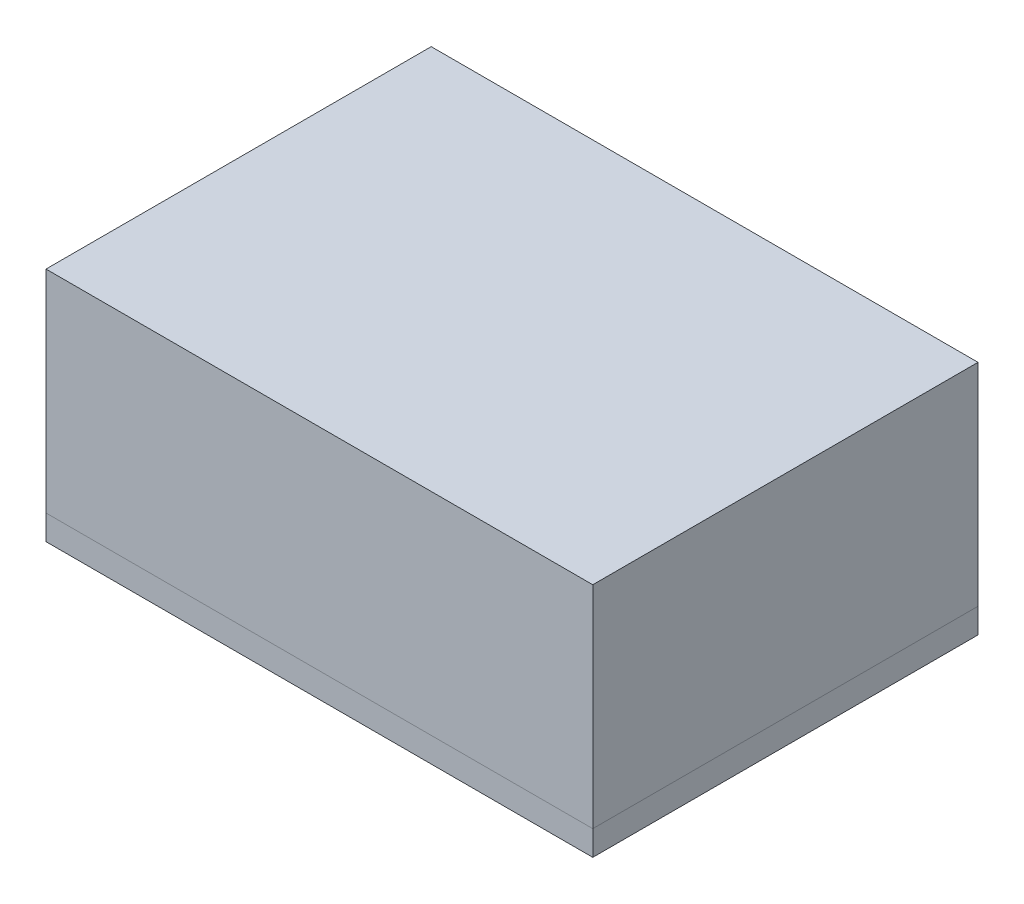
ISO-10303-21;
HEADER;
FILE_DESCRIPTION(('STEP AP214'),'2;1');
FILE_NAME('part.step','',(''),(''),'','','');
FILE_SCHEMA(('AUTOMOTIVE_DESIGN { 1 0 10303 214 1 1 1 1 }'));
ENDSEC;
DATA;
#1=APPLICATION_CONTEXT('core data for automotive mechanical design processes');
#2=APPLICATION_PROTOCOL_DEFINITION('international standard','automotive_design',2000,#1);
#3=PRODUCT_CONTEXT('',#1,'mechanical');
#4=PRODUCT('Part','Part','',(#3));
#5=PRODUCT_RELATED_PRODUCT_CATEGORY('part','',(#4));
#6=PRODUCT_DEFINITION_FORMATION('','',#4);
#7=PRODUCT_DEFINITION_CONTEXT('part definition',#1,'design');
#8=PRODUCT_DEFINITION('design','',#6,#7);
#9=PRODUCT_DEFINITION_SHAPE('','',#8);
#10=(LENGTH_UNIT() NAMED_UNIT(*) SI_UNIT(.MILLI.,.METRE.));
#11=(NAMED_UNIT(*) PLANE_ANGLE_UNIT() SI_UNIT($,.RADIAN.));
#12=(NAMED_UNIT(*) SI_UNIT($,.STERADIAN.) SOLID_ANGLE_UNIT());
#13=UNCERTAINTY_MEASURE_WITH_UNIT(LENGTH_MEASURE(1.E-05),#10,'distance_accuracy_value','');
#14=(GEOMETRIC_REPRESENTATION_CONTEXT(3) GLOBAL_UNCERTAINTY_ASSIGNED_CONTEXT((#13)) GLOBAL_UNIT_ASSIGNED_CONTEXT((#10,
#11,#12)) REPRESENTATION_CONTEXT('',''));
#15=CARTESIAN_POINT('',(0.,0.,0.));
#16=DIRECTION('',(0.,0.,1.));
#17=DIRECTION('',(1.,0.,0.));
#18=AXIS2_PLACEMENT_3D('',#15,#16,#17);
#19=CARTESIAN_POINT('',(0.,1.,0.));
#20=DIRECTION('',(1.,0.,0.));
#21=DIRECTION('',(0.,0.,-1.));
#22=AXIS2_PLACEMENT_3D('',#19,#20,#21);
#23=PLANE('',#22);
#24=DIRECTION('',(0.,-1.,0.));
#25=VECTOR('',#24,1.);
#26=CARTESIAN_POINT('',(0.,1.,15.5));
#27=LINE('',#26,#25);
#28=CARTESIAN_POINT('',(0.,1.,15.5));
#29=VERTEX_POINT('',#28);
#30=CARTESIAN_POINT('',(0.,0.,15.5));
#31=VERTEX_POINT('',#30);
#32=EDGE_CURVE('E90',#29,#31,#27,.T.);
#33=ORIENTED_EDGE('',*,*,#32,.F.);
#34=DIRECTION('',(0.,0.,-1.));
#35=VECTOR('',#34,1.);
#36=CARTESIAN_POINT('',(0.,1.,0.));
#37=LINE('',#36,#35);
#38=CARTESIAN_POINT('',(0.,1.,0.));
#39=VERTEX_POINT('',#38);
#40=EDGE_CURVE('E13',#29,#39,#37,.T.);
#41=ORIENTED_EDGE('',*,*,#40,.T.);
#42=DIRECTION('',(0.,-1.,0.));
#43=VECTOR('',#42,1.);
#44=CARTESIAN_POINT('',(0.,1.,0.));
#45=LINE('',#44,#43);
#46=CARTESIAN_POINT('',(0.,0.,0.));
#47=VERTEX_POINT('',#46);
#48=EDGE_CURVE('E108',#39,#47,#45,.T.);
#49=ORIENTED_EDGE('',*,*,#48,.T.);
#50=DIRECTION('',(0.,0.,1.));
#51=VECTOR('',#50,1.);
#52=CARTESIAN_POINT('',(0.,0.,0.));
#53=LINE('',#52,#51);
#54=EDGE_CURVE('E103',#47,#31,#53,.T.);
#55=ORIENTED_EDGE('',*,*,#54,.T.);
#56=EDGE_LOOP('',(#33,#41,#49,#55));
#57=FACE_BOUND('',#56,.T.);
#58=ADVANCED_FACE('F51',(#57),#23,.F.);
#59=CARTESIAN_POINT('',(0.,1.,15.5));
#60=DIRECTION('',(0.,0.,-1.));
#61=DIRECTION('',(-1.,0.,0.));
#62=AXIS2_PLACEMENT_3D('',#59,#60,#61);
#63=PLANE('',#62);
#64=DIRECTION('',(0.,-1.,0.));
#65=VECTOR('',#64,1.);
#66=CARTESIAN_POINT('',(22.,1.,15.5));
#67=LINE('',#66,#65);
#68=CARTESIAN_POINT('',(22.,1.,15.5));
#69=VERTEX_POINT('',#68);
#70=CARTESIAN_POINT('',(22.,0.,15.5));
#71=VERTEX_POINT('',#70);
#72=EDGE_CURVE('E97',#69,#71,#67,.T.);
#73=ORIENTED_EDGE('',*,*,#72,.F.);
#74=DIRECTION('',(-1.,0.,0.));
#75=VECTOR('',#74,1.);
#76=CARTESIAN_POINT('',(0.,1.,15.5));
#77=LINE('',#76,#75);
#78=EDGE_CURVE('E58',#69,#29,#77,.T.);
#79=ORIENTED_EDGE('',*,*,#78,.T.);
#80=ORIENTED_EDGE('',*,*,#32,.T.);
#81=DIRECTION('',(1.,0.,0.));
#82=VECTOR('',#81,1.);
#83=CARTESIAN_POINT('',(0.,0.,15.5));
#84=LINE('',#83,#82);
#85=EDGE_CURVE('E93',#31,#71,#84,.T.);
#86=ORIENTED_EDGE('',*,*,#85,.T.);
#87=EDGE_LOOP('',(#73,#79,#80,#86));
#88=FACE_BOUND('',#87,.T.);
#89=ADVANCED_FACE('F92',(#88),#63,.F.);
#90=CARTESIAN_POINT('',(22.,1.,0.));
#91=DIRECTION('',(-1.,0.,0.));
#92=DIRECTION('',(0.,0.,1.));
#93=AXIS2_PLACEMENT_3D('',#90,#91,#92);
#94=PLANE('',#93);
#95=DIRECTION('',(0.,-1.,0.));
#96=VECTOR('',#95,1.);
#97=CARTESIAN_POINT('',(22.,1.,0.));
#98=LINE('',#97,#96);
#99=CARTESIAN_POINT('',(22.,1.,0.));
#100=VERTEX_POINT('',#99);
#101=CARTESIAN_POINT('',(22.,0.,0.));
#102=VERTEX_POINT('',#101);
#103=EDGE_CURVE('E118',#100,#102,#98,.T.);
#104=ORIENTED_EDGE('',*,*,#103,.F.);
#105=DIRECTION('',(0.,0.,1.));
#106=VECTOR('',#105,1.);
#107=CARTESIAN_POINT('',(22.,1.,0.));
#108=LINE('',#107,#106);
#109=EDGE_CURVE('E72',#100,#69,#108,.T.);
#110=ORIENTED_EDGE('',*,*,#109,.T.);
#111=ORIENTED_EDGE('',*,*,#72,.T.);
#112=DIRECTION('',(0.,0.,-1.));
#113=VECTOR('',#112,1.);
#114=CARTESIAN_POINT('',(22.,0.,0.));
#115=LINE('',#114,#113);
#116=EDGE_CURVE('E105',#71,#102,#115,.T.);
#117=ORIENTED_EDGE('',*,*,#116,.T.);
#118=EDGE_LOOP('',(#104,#110,#111,#117));
#119=FACE_BOUND('',#118,.T.);
#120=ADVANCED_FACE('F121',(#119),#94,.F.);
#121=CARTESIAN_POINT('',(0.,1.,0.));
#122=DIRECTION('',(0.,0.,1.));
#123=DIRECTION('',(1.,0.,0.));
#124=AXIS2_PLACEMENT_3D('',#121,#122,#123);
#125=PLANE('',#124);
#126=ORIENTED_EDGE('',*,*,#48,.F.);
#127=DIRECTION('',(-1.,0.,0.));
#128=VECTOR('',#127,1.);
#129=CARTESIAN_POINT('',(0.,1.,0.));
#130=LINE('',#129,#128);
#131=EDGE_CURVE('E112',#100,#39,#130,.T.);
#132=ORIENTED_EDGE('',*,*,#131,.F.);
#133=ORIENTED_EDGE('',*,*,#103,.T.);
#134=DIRECTION('',(-1.,0.,0.));
#135=VECTOR('',#134,1.);
#136=CARTESIAN_POINT('',(0.,0.,0.));
#137=LINE('',#136,#135);
#138=EDGE_CURVE('E115',#102,#47,#137,.T.);
#139=ORIENTED_EDGE('',*,*,#138,.T.);
#140=EDGE_LOOP('',(#126,#132,#133,#139));
#141=FACE_BOUND('',#140,.T.);
#142=ADVANCED_FACE('F123',(#141),#125,.F.);
#143=CARTESIAN_POINT('',(0.,0.,0.));
#144=DIRECTION('',(0.,1.,0.));
#145=DIRECTION('',(0.,0.,1.));
#146=AXIS2_PLACEMENT_3D('',#143,#144,#145);
#147=PLANE('',#146);
#148=ORIENTED_EDGE('',*,*,#54,.F.);
#149=ORIENTED_EDGE('',*,*,#138,.F.);
#150=ORIENTED_EDGE('',*,*,#116,.F.);
#151=ORIENTED_EDGE('',*,*,#85,.F.);
#152=EDGE_LOOP('',(#148,#149,#150,#151));
#153=FACE_BOUND('',#152,.T.);
#154=ADVANCED_FACE('F101',(#153),#147,.F.);
#155=CARTESIAN_POINT('',(0.,1.,0.));
#156=DIRECTION('',(0.,1.,0.));
#157=DIRECTION('',(0.,0.,1.));
#158=AXIS2_PLACEMENT_3D('',#155,#156,#157);
#159=PLANE('',#158);
#160=ORIENTED_EDGE('',*,*,#131,.T.);
#161=ORIENTED_EDGE('',*,*,#40,.F.);
#162=ORIENTED_EDGE('',*,*,#78,.F.);
#163=ORIENTED_EDGE('',*,*,#109,.F.);
#164=EDGE_LOOP('',(#160,#161,#162,#163));
#165=FACE_BOUND('',#164,.T.);
#166=ADVANCED_FACE('F125',(#165),#159,.T.);
#167=CLOSED_SHELL('',(#58,#89,#120,#142,#154,#166));
#168=MANIFOLD_SOLID_BREP('B2',#167);
#169=CARTESIAN_POINT('',(0.,1.,15.5));
#170=DIRECTION('',(0.,0.,-1.));
#171=DIRECTION('',(-1.,0.,0.));
#172=AXIS2_PLACEMENT_3D('',#169,#170,#171);
#173=PLANE('',#172);
#174=DIRECTION('',(-1.,0.,0.));
#175=VECTOR('',#174,1.);
#176=CARTESIAN_POINT('',(0.,1.,15.5));
#177=LINE('',#176,#175);
#178=CARTESIAN_POINT('',(22.,1.,15.5));
#179=VERTEX_POINT('',#178);
#180=CARTESIAN_POINT('',(0.,1.,15.5));
#181=VERTEX_POINT('',#180);
#182=EDGE_CURVE('E426',#179,#181,#177,.T.);
#183=ORIENTED_EDGE('',*,*,#182,.F.);
#184=DIRECTION('',(0.,-1.,0.));
#185=VECTOR('',#184,1.);
#186=CARTESIAN_POINT('',(22.,1.,15.5));
#187=LINE('',#186,#185);
#188=CARTESIAN_POINT('',(22.,9.5,15.5));
#189=VERTEX_POINT('',#188);
#190=EDGE_CURVE('E267',#189,#179,#187,.T.);
#191=ORIENTED_EDGE('',*,*,#190,.F.);
#192=DIRECTION('',(1.,0.,0.));
#193=VECTOR('',#192,1.);
#194=CARTESIAN_POINT('',(0.,9.5,15.5));
#195=LINE('',#194,#193);
#196=CARTESIAN_POINT('',(0.,9.5,15.5));
#197=VERTEX_POINT('',#196);
#198=EDGE_CURVE('E252',#197,#189,#195,.T.);
#199=ORIENTED_EDGE('',*,*,#198,.F.);
#200=DIRECTION('',(0.,-1.,0.));
#201=VECTOR('',#200,1.);
#202=CARTESIAN_POINT('',(0.,1.,15.5));
#203=LINE('',#202,#201);
#204=EDGE_CURVE('E260',#197,#181,#203,.T.);
#205=ORIENTED_EDGE('',*,*,#204,.T.);
#206=EDGE_LOOP('',(#183,#191,#199,#205));
#207=FACE_BOUND('',#206,.T.);
#208=ADVANCED_FACE('F243',(#207),#173,.F.);
#209=CARTESIAN_POINT('',(22.,1.,0.));
#210=DIRECTION('',(-1.,0.,0.));
#211=DIRECTION('',(0.,0.,1.));
#212=AXIS2_PLACEMENT_3D('',#209,#210,#211);
#213=PLANE('',#212);
#214=DIRECTION('',(0.,0.,1.));
#215=VECTOR('',#214,1.);
#216=CARTESIAN_POINT('',(22.,1.,0.));
#217=LINE('',#216,#215);
#218=CARTESIAN_POINT('',(22.,1.,0.));
#219=VERTEX_POINT('',#218);
#220=EDGE_CURVE('E356',#219,#179,#217,.T.);
#221=ORIENTED_EDGE('',*,*,#220,.F.);
#222=DIRECTION('',(0.,-1.,0.));
#223=VECTOR('',#222,1.);
#224=CARTESIAN_POINT('',(22.,1.,0.));
#225=LINE('',#224,#223);
#226=CARTESIAN_POINT('',(22.,9.5,0.));
#227=VERTEX_POINT('',#226);
#228=EDGE_CURVE('E431',#227,#219,#225,.T.);
#229=ORIENTED_EDGE('',*,*,#228,.F.);
#230=DIRECTION('',(0.,0.,-1.));
#231=VECTOR('',#230,1.);
#232=CARTESIAN_POINT('',(22.,9.5,0.));
#233=LINE('',#232,#231);
#234=EDGE_CURVE('E417',#189,#227,#233,.T.);
#235=ORIENTED_EDGE('',*,*,#234,.F.);
#236=ORIENTED_EDGE('',*,*,#190,.T.);
#237=EDGE_LOOP('',(#221,#229,#235,#236));
#238=FACE_BOUND('',#237,.T.);
#239=ADVANCED_FACE('F448',(#238),#213,.F.);
#240=CARTESIAN_POINT('',(0.,9.5,0.));
#241=DIRECTION('',(0.,1.,0.));
#242=DIRECTION('',(0.,0.,1.));
#243=AXIS2_PLACEMENT_3D('',#240,#241,#242);
#244=PLANE('',#243);
#245=DIRECTION('',(0.,0.,1.));
#246=VECTOR('',#245,1.);
#247=CARTESIAN_POINT('',(0.,9.5,0.));
#248=LINE('',#247,#246);
#249=CARTESIAN_POINT('',(0.,9.5,0.));
#250=VERTEX_POINT('',#249);
#251=EDGE_CURVE('E49',#250,#197,#248,.T.);
#252=ORIENTED_EDGE('',*,*,#251,.T.);
#253=ORIENTED_EDGE('',*,*,#198,.T.);
#254=ORIENTED_EDGE('',*,*,#234,.T.);
#255=DIRECTION('',(-1.,0.,0.));
#256=VECTOR('',#255,1.);
#257=CARTESIAN_POINT('',(0.,9.5,0.));
#258=LINE('',#257,#256);
#259=EDGE_CURVE('E406',#227,#250,#258,.T.);
#260=ORIENTED_EDGE('',*,*,#259,.T.);
#261=EDGE_LOOP('',(#252,#253,#254,#260));
#262=FACE_BOUND('',#261,.T.);
#263=ADVANCED_FACE('F452',(#262),#244,.T.);
#264=CARTESIAN_POINT('',(0.,1.,0.));
#265=DIRECTION('',(1.,0.,0.));
#266=DIRECTION('',(0.,0.,-1.));
#267=AXIS2_PLACEMENT_3D('',#264,#265,#266);
#268=PLANE('',#267);
#269=DIRECTION('',(0.,0.,-1.));
#270=VECTOR('',#269,1.);
#271=CARTESIAN_POINT('',(0.,1.,0.));
#272=LINE('',#271,#270);
#273=CARTESIAN_POINT('',(0.,1.,0.));
#274=VERTEX_POINT('',#273);
#275=EDGE_CURVE('E355',#181,#274,#272,.T.);
#276=ORIENTED_EDGE('',*,*,#275,.F.);
#277=ORIENTED_EDGE('',*,*,#204,.F.);
#278=ORIENTED_EDGE('',*,*,#251,.F.);
#279=DIRECTION('',(0.,-1.,0.));
#280=VECTOR('',#279,1.);
#281=CARTESIAN_POINT('',(0.,1.,0.));
#282=LINE('',#281,#280);
#283=EDGE_CURVE('E367',#250,#274,#282,.T.);
#284=ORIENTED_EDGE('',*,*,#283,.T.);
#285=EDGE_LOOP('',(#276,#277,#278,#284));
#286=FACE_BOUND('',#285,.T.);
#287=ADVANCED_FACE('F450',(#286),#268,.F.);
#288=CARTESIAN_POINT('',(17.05,6.,0.));
#289=DIRECTION('',(1.,0.,0.));
#290=DIRECTION('',(0.,0.,-1.));
#291=AXIS2_PLACEMENT_3D('',#288,#289,#290);
#292=PLANE('',#291);
#293=DIRECTION('',(0.,0.,1.));
#294=VECTOR('',#293,1.);
#295=CARTESIAN_POINT('',(17.05,1.,0.));
#296=LINE('',#295,#294);
#297=CARTESIAN_POINT('',(17.05,1.,0.));
#298=VERTEX_POINT('',#297);
#299=CARTESIAN_POINT('',(17.05,1.,1.));
#300=VERTEX_POINT('',#299);
#301=EDGE_CURVE('E403',#298,#300,#296,.T.);
#302=ORIENTED_EDGE('',*,*,#301,.T.);
#303=DIRECTION('',(0.,-1.,0.));
#304=VECTOR('',#303,1.);
#305=CARTESIAN_POINT('',(17.05,6.,1.));
#306=LINE('',#305,#304);
#307=CARTESIAN_POINT('',(17.05,6.,1.));
#308=VERTEX_POINT('',#307);
#309=EDGE_CURVE('E392',#308,#300,#306,.T.);
#310=ORIENTED_EDGE('',*,*,#309,.F.);
#311=DIRECTION('',(0.,0.,1.));
#312=VECTOR('',#311,1.);
#313=CARTESIAN_POINT('',(17.05,6.,0.));
#314=LINE('',#313,#312);
#315=CARTESIAN_POINT('',(17.05,6.,0.));
#316=VERTEX_POINT('',#315);
#317=EDGE_CURVE('E399',#316,#308,#314,.T.);
#318=ORIENTED_EDGE('',*,*,#317,.F.);
#319=DIRECTION('',(0.,-1.,0.));
#320=VECTOR('',#319,1.);
#321=CARTESIAN_POINT('',(17.05,6.,0.));
#322=LINE('',#321,#320);
#323=EDGE_CURVE('E435',#316,#298,#322,.T.);
#324=ORIENTED_EDGE('',*,*,#323,.T.);
#325=EDGE_LOOP('',(#302,#310,#318,#324));
#326=FACE_BOUND('',#325,.T.);
#327=ADVANCED_FACE('F446',(#326),#292,.F.);
#328=CARTESIAN_POINT('',(21.,6.,0.));
#329=DIRECTION('',(1.,0.,0.));
#330=DIRECTION('',(0.,0.,-1.));
#331=AXIS2_PLACEMENT_3D('',#328,#329,#330);
#332=PLANE('',#331);
#333=DIRECTION('',(0.,0.,1.));
#334=VECTOR('',#333,1.);
#335=CARTESIAN_POINT('',(21.,1.,0.));
#336=LINE('',#335,#334);
#337=CARTESIAN_POINT('',(21.,1.,1.));
#338=VERTEX_POINT('',#337);
#339=CARTESIAN_POINT('',(21.,1.,14.5));
#340=VERTEX_POINT('',#339);
#341=EDGE_CURVE('E376',#338,#340,#336,.T.);
#342=ORIENTED_EDGE('',*,*,#341,.T.);
#343=DIRECTION('',(0.,-1.,0.));
#344=VECTOR('',#343,1.);
#345=CARTESIAN_POINT('',(21.,6.,14.5));
#346=LINE('',#345,#344);
#347=CARTESIAN_POINT('',(21.,8.,14.5));
#348=VERTEX_POINT('',#347);
#349=EDGE_CURVE('E382',#348,#340,#346,.T.);
#350=ORIENTED_EDGE('',*,*,#349,.F.);
#351=DIRECTION('',(0.,0.,-1.));
#352=VECTOR('',#351,1.);
#353=CARTESIAN_POINT('',(21.,8.,14.5));
#354=LINE('',#353,#352);
#355=CARTESIAN_POINT('',(21.,8.,1.));
#356=VERTEX_POINT('',#355);
#357=EDGE_CURVE('E410',#348,#356,#354,.T.);
#358=ORIENTED_EDGE('',*,*,#357,.T.);
#359=DIRECTION('',(0.,-1.,0.));
#360=VECTOR('',#359,1.);
#361=CARTESIAN_POINT('',(21.,6.,1.));
#362=LINE('',#361,#360);
#363=EDGE_CURVE('E388',#356,#338,#362,.T.);
#364=ORIENTED_EDGE('',*,*,#363,.T.);
#365=EDGE_LOOP('',(#342,#350,#358,#364));
#366=FACE_BOUND('',#365,.T.);
#367=ADVANCED_FACE('F458',(#366),#332,.F.);
#368=CARTESIAN_POINT('',(0.,6.,14.5));
#369=DIRECTION('',(0.,0.,-1.));
#370=DIRECTION('',(-1.,0.,0.));
#371=AXIS2_PLACEMENT_3D('',#368,#369,#370);
#372=PLANE('',#371);
#373=DIRECTION('',(1.,0.,0.));
#374=VECTOR('',#373,1.);
#375=CARTESIAN_POINT('',(0.,1.,14.5));
#376=LINE('',#375,#374);
#377=CARTESIAN_POINT('',(1.,1.,14.5));
#378=VERTEX_POINT('',#377);
#379=EDGE_CURVE('E247',#378,#340,#376,.T.);
#380=ORIENTED_EDGE('',*,*,#379,.F.);
#381=DIRECTION('',(0.,-1.,0.));
#382=VECTOR('',#381,1.);
#383=CARTESIAN_POINT('',(1.,6.,14.5));
#384=LINE('',#383,#382);
#385=CARTESIAN_POINT('',(1.,8.,14.5));
#386=VERTEX_POINT('',#385);
#387=EDGE_CURVE('E387',#386,#378,#384,.T.);
#388=ORIENTED_EDGE('',*,*,#387,.F.);
#389=DIRECTION('',(1.,0.,0.));
#390=VECTOR('',#389,1.);
#391=CARTESIAN_POINT('',(1.,8.,14.5));
#392=LINE('',#391,#390);
#393=EDGE_CURVE('E384',#386,#348,#392,.T.);
#394=ORIENTED_EDGE('',*,*,#393,.T.);
#395=ORIENTED_EDGE('',*,*,#349,.T.);
#396=EDGE_LOOP('',(#380,#388,#394,#395));
#397=FACE_BOUND('',#396,.T.);
#398=ADVANCED_FACE('F383',(#397),#372,.T.);
#399=CARTESIAN_POINT('',(0.,8.,0.));
#400=DIRECTION('',(0.,1.,0.));
#401=DIRECTION('',(0.,0.,1.));
#402=AXIS2_PLACEMENT_3D('',#399,#400,#401);
#403=PLANE('',#402);
#404=ORIENTED_EDGE('',*,*,#393,.F.);
#405=DIRECTION('',(0.,0.,1.));
#406=VECTOR('',#405,1.);
#407=CARTESIAN_POINT('',(1.,8.,1.));
#408=LINE('',#407,#406);
#409=CARTESIAN_POINT('',(1.,8.,1.));
#410=VERTEX_POINT('',#409);
#411=EDGE_CURVE('E407',#410,#386,#408,.T.);
#412=ORIENTED_EDGE('',*,*,#411,.F.);
#413=DIRECTION('',(-1.,0.,0.));
#414=VECTOR('',#413,1.);
#415=CARTESIAN_POINT('',(21.,8.,1.));
#416=LINE('',#415,#414);
#417=EDGE_CURVE('E402',#356,#410,#416,.T.);
#418=ORIENTED_EDGE('',*,*,#417,.F.);
#419=ORIENTED_EDGE('',*,*,#357,.F.);
#420=EDGE_LOOP('',(#404,#412,#418,#419));
#421=FACE_BOUND('',#420,.T.);
#422=ADVANCED_FACE('F563',(#421),#403,.F.);
#423=CARTESIAN_POINT('',(0.,6.,1.));
#424=DIRECTION('',(0.,0.,-1.));
#425=DIRECTION('',(-1.,0.,0.));
#426=AXIS2_PLACEMENT_3D('',#423,#424,#425);
#427=PLANE('',#426);
#428=DIRECTION('',(1.,0.,0.));
#429=VECTOR('',#428,1.);
#430=CARTESIAN_POINT('',(0.,1.,1.));
#431=LINE('',#430,#429);
#432=EDGE_CURVE('E422',#300,#338,#431,.T.);
#433=ORIENTED_EDGE('',*,*,#432,.T.);
#434=ORIENTED_EDGE('',*,*,#363,.F.);
#435=ORIENTED_EDGE('',*,*,#417,.T.);
#436=DIRECTION('',(0.,-1.,0.));
#437=VECTOR('',#436,1.);
#438=CARTESIAN_POINT('',(1.,6.,1.));
#439=LINE('',#438,#437);
#440=CARTESIAN_POINT('',(1.,1.,1.));
#441=VERTEX_POINT('',#440);
#442=EDGE_CURVE('E390',#410,#441,#439,.T.);
#443=ORIENTED_EDGE('',*,*,#442,.T.);
#444=DIRECTION('',(-1.,0.,0.));
#445=VECTOR('',#444,1.);
#446=CARTESIAN_POINT('',(0.,1.,1.));
#447=LINE('',#446,#445);
#448=CARTESIAN_POINT('',(4.95,1.,1.));
#449=VERTEX_POINT('',#448);
#450=EDGE_CURVE('E361',#449,#441,#447,.T.);
#451=ORIENTED_EDGE('',*,*,#450,.F.);
#452=DIRECTION('',(0.,-1.,0.));
#453=VECTOR('',#452,1.);
#454=CARTESIAN_POINT('',(4.95,6.,1.));
#455=LINE('',#454,#453);
#456=CARTESIAN_POINT('',(4.95,6.,1.));
#457=VERTEX_POINT('',#456);
#458=EDGE_CURVE('E345',#457,#449,#455,.T.);
#459=ORIENTED_EDGE('',*,*,#458,.F.);
#460=DIRECTION('',(-1.,0.,0.));
#461=VECTOR('',#460,1.);
#462=CARTESIAN_POINT('',(21.,6.,1.));
#463=LINE('',#462,#461);
#464=EDGE_CURVE('E404',#308,#457,#463,.T.);
#465=ORIENTED_EDGE('',*,*,#464,.F.);
#466=ORIENTED_EDGE('',*,*,#309,.T.);
#467=EDGE_LOOP('',(#433,#434,#435,#443,#451,#459,#465,#466));
#468=FACE_BOUND('',#467,.T.);
#469=ADVANCED_FACE('F444',(#468),#427,.F.);
#470=CARTESIAN_POINT('',(0.,6.,0.));
#471=DIRECTION('',(0.,1.,0.));
#472=DIRECTION('',(0.,0.,1.));
#473=AXIS2_PLACEMENT_3D('',#470,#471,#472);
#474=PLANE('',#473);
#475=DIRECTION('',(-1.,0.,0.));
#476=VECTOR('',#475,1.);
#477=CARTESIAN_POINT('',(22.,6.,0.));
#478=LINE('',#477,#476);
#479=CARTESIAN_POINT('',(4.95,6.,0.));
#480=VERTEX_POINT('',#479);
#481=EDGE_CURVE('E340',#316,#480,#478,.T.);
#482=ORIENTED_EDGE('',*,*,#481,.F.);
#483=ORIENTED_EDGE('',*,*,#317,.T.);
#484=ORIENTED_EDGE('',*,*,#464,.T.);
#485=DIRECTION('',(0.,0.,1.));
#486=VECTOR('',#485,1.);
#487=CARTESIAN_POINT('',(4.95,6.,0.));
#488=LINE('',#487,#486);
#489=EDGE_CURVE('E344',#480,#457,#488,.T.);
#490=ORIENTED_EDGE('',*,*,#489,.F.);
#491=EDGE_LOOP('',(#482,#483,#484,#490));
#492=FACE_BOUND('',#491,.T.);
#493=ADVANCED_FACE('F552',(#492),#474,.F.);
#494=CARTESIAN_POINT('',(0.,1.,0.));
#495=DIRECTION('',(0.,0.,1.));
#496=DIRECTION('',(1.,0.,0.));
#497=AXIS2_PLACEMENT_3D('',#494,#495,#496);
#498=PLANE('',#497);
#499=DIRECTION('',(1.,0.,0.));
#500=VECTOR('',#499,1.);
#501=CARTESIAN_POINT('',(0.,1.,0.));
#502=LINE('',#501,#500);
#503=CARTESIAN_POINT('',(4.95,1.,0.));
#504=VERTEX_POINT('',#503);
#505=EDGE_CURVE('E338',#274,#504,#502,.T.);
#506=ORIENTED_EDGE('',*,*,#505,.F.);
#507=ORIENTED_EDGE('',*,*,#283,.F.);
#508=ORIENTED_EDGE('',*,*,#259,.F.);
#509=ORIENTED_EDGE('',*,*,#228,.T.);
#510=EDGE_CURVE('E357',#298,#219,#502,.T.);
#511=ORIENTED_EDGE('',*,*,#510,.F.);
#512=ORIENTED_EDGE('',*,*,#323,.F.);
#513=ORIENTED_EDGE('',*,*,#481,.T.);
#514=DIRECTION('',(0.,-1.,0.));
#515=VECTOR('',#514,1.);
#516=CARTESIAN_POINT('',(4.95,6.,0.));
#517=LINE('',#516,#515);
#518=EDGE_CURVE('E336',#480,#504,#517,.T.);
#519=ORIENTED_EDGE('',*,*,#518,.T.);
#520=EDGE_LOOP('',(#506,#507,#508,#509,#511,#512,#513,#519));
#521=FACE_BOUND('',#520,.T.);
#522=ADVANCED_FACE('F245',(#521),#498,.F.);
#523=CARTESIAN_POINT('',(4.95,6.,0.));
#524=DIRECTION('',(1.,0.,0.));
#525=DIRECTION('',(0.,0.,-1.));
#526=AXIS2_PLACEMENT_3D('',#523,#524,#525);
#527=PLANE('',#526);
#528=DIRECTION('',(0.,0.,1.));
#529=VECTOR('',#528,1.);
#530=CARTESIAN_POINT('',(4.95,1.,0.));
#531=LINE('',#530,#529);
#532=EDGE_CURVE('E352',#504,#449,#531,.T.);
#533=ORIENTED_EDGE('',*,*,#532,.F.);
#534=ORIENTED_EDGE('',*,*,#518,.F.);
#535=ORIENTED_EDGE('',*,*,#489,.T.);
#536=ORIENTED_EDGE('',*,*,#458,.T.);
#537=EDGE_LOOP('',(#533,#534,#535,#536));
#538=FACE_BOUND('',#537,.T.);
#539=ADVANCED_FACE('F359',(#538),#527,.T.);
#540=CARTESIAN_POINT('',(1.,6.,0.));
#541=DIRECTION('',(1.,0.,0.));
#542=DIRECTION('',(0.,0.,-1.));
#543=AXIS2_PLACEMENT_3D('',#540,#541,#542);
#544=PLANE('',#543);
#545=DIRECTION('',(0.,0.,1.));
#546=VECTOR('',#545,1.);
#547=CARTESIAN_POINT('',(1.,1.,0.));
#548=LINE('',#547,#546);
#549=EDGE_CURVE('E364',#441,#378,#548,.T.);
#550=ORIENTED_EDGE('',*,*,#549,.F.);
#551=ORIENTED_EDGE('',*,*,#442,.F.);
#552=ORIENTED_EDGE('',*,*,#411,.T.);
#553=ORIENTED_EDGE('',*,*,#387,.T.);
#554=EDGE_LOOP('',(#550,#551,#552,#553));
#555=FACE_BOUND('',#554,.T.);
#556=ADVANCED_FACE('F465',(#555),#544,.T.);
#557=CARTESIAN_POINT('',(0.,1.,0.));
#558=DIRECTION('',(0.,-1.,0.));
#559=DIRECTION('',(0.,0.,-1.));
#560=AXIS2_PLACEMENT_3D('',#557,#558,#559);
#561=PLANE('',#560);
#562=ORIENTED_EDGE('',*,*,#275,.T.);
#563=ORIENTED_EDGE('',*,*,#505,.T.);
#564=ORIENTED_EDGE('',*,*,#532,.T.);
#565=ORIENTED_EDGE('',*,*,#450,.T.);
#566=ORIENTED_EDGE('',*,*,#549,.T.);
#567=ORIENTED_EDGE('',*,*,#379,.T.);
#568=ORIENTED_EDGE('',*,*,#341,.F.);
#569=ORIENTED_EDGE('',*,*,#432,.F.);
#570=ORIENTED_EDGE('',*,*,#301,.F.);
#571=ORIENTED_EDGE('',*,*,#510,.T.);
#572=ORIENTED_EDGE('',*,*,#220,.T.);
#573=ORIENTED_EDGE('',*,*,#182,.T.);
#574=EDGE_LOOP('',(#562,#563,#564,#565,#566,#567,#568,#569,#570,#571,#572,#573));
#575=FACE_BOUND('',#574,.T.);
#576=ADVANCED_FACE('F350',(#575),#561,.T.);
#577=CLOSED_SHELL('',(#208,#239,#263,#287,#327,#367,#398,#422,#469,#493,#522,#539,#556,#576));
#578=MANIFOLD_SOLID_BREP('B7',#577);
#579=ADVANCED_BREP_SHAPE_REPRESENTATION('',(#18,#168,#578),#14);
#580=SHAPE_DEFINITION_REPRESENTATION(#9,#579);
ENDSEC;
END-ISO-10303-21;
